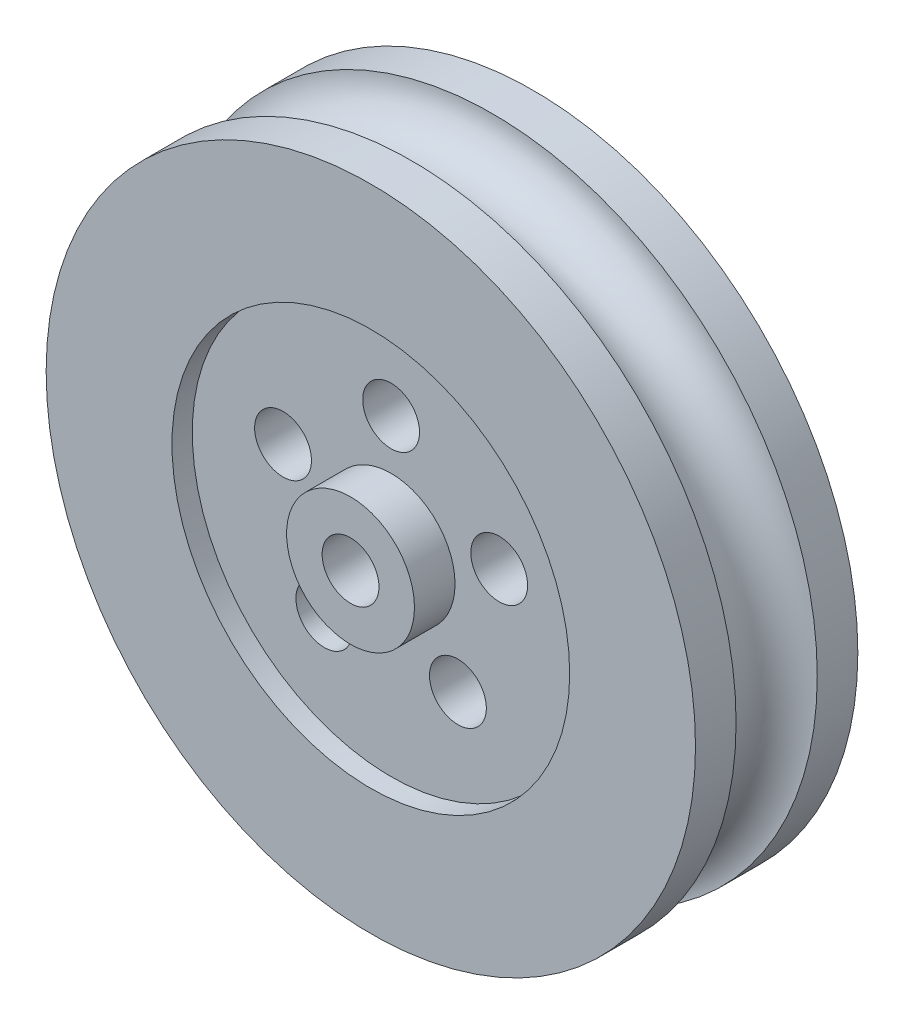
ISO-10303-21;
HEADER;
FILE_DESCRIPTION(('STEP AP214'),'2;1');
FILE_NAME('part.step','',(''),(''),'','','');
FILE_SCHEMA(('AUTOMOTIVE_DESIGN { 1 0 10303 214 1 1 1 1 }'));
ENDSEC;
DATA;
#1=APPLICATION_CONTEXT('core data for automotive mechanical design processes');
#2=APPLICATION_PROTOCOL_DEFINITION('international standard','automotive_design',2000,#1);
#3=PRODUCT_CONTEXT('',#1,'mechanical');
#4=PRODUCT('Part','Part','',(#3));
#5=PRODUCT_RELATED_PRODUCT_CATEGORY('part','',(#4));
#6=PRODUCT_DEFINITION_FORMATION('','',#4);
#7=PRODUCT_DEFINITION_CONTEXT('part definition',#1,'design');
#8=PRODUCT_DEFINITION('design','',#6,#7);
#9=PRODUCT_DEFINITION_SHAPE('','',#8);
#10=(LENGTH_UNIT() NAMED_UNIT(*) SI_UNIT(.MILLI.,.METRE.));
#11=(NAMED_UNIT(*) PLANE_ANGLE_UNIT() SI_UNIT($,.RADIAN.));
#12=(NAMED_UNIT(*) SI_UNIT($,.STERADIAN.) SOLID_ANGLE_UNIT());
#13=UNCERTAINTY_MEASURE_WITH_UNIT(LENGTH_MEASURE(1.E-05),#10,'distance_accuracy_value','');
#14=(GEOMETRIC_REPRESENTATION_CONTEXT(3) GLOBAL_UNCERTAINTY_ASSIGNED_CONTEXT((#13)) GLOBAL_UNIT_ASSIGNED_CONTEXT((#10,
#11,#12)) REPRESENTATION_CONTEXT('',''));
#15=CARTESIAN_POINT('',(0.,0.,0.));
#16=DIRECTION('',(0.,0.,1.));
#17=DIRECTION('',(1.,0.,0.));
#18=AXIS2_PLACEMENT_3D('',#15,#16,#17);
#19=CARTESIAN_POINT('',(0.,0.,4.));
#20=DIRECTION('',(0.,0.,-1.));
#21=DIRECTION('',(-1.,0.,0.));
#22=AXIS2_PLACEMENT_3D('',#19,#20,#21);
#23=CYLINDRICAL_SURFACE('',#22,16.);
#24=CARTESIAN_POINT('',(0.,0.,-4.));
#25=DIRECTION('',(0.,0.,1.));
#26=DIRECTION('',(1.,0.,0.));
#27=AXIS2_PLACEMENT_3D('',#24,#25,#26);
#28=CIRCLE('',#27,16.);
#29=CARTESIAN_POINT('',(16.,0.,-4.));
#30=VERTEX_POINT('',#29);
#31=EDGE_CURVE('E43',#30,#30,#28,.T.);
#32=ORIENTED_EDGE('',*,*,#31,.T.);
#33=EDGE_LOOP('',(#32));
#34=FACE_BOUND('',#33,.T.);
#35=CARTESIAN_POINT('',(0.,0.,-2.00000000000001));
#36=DIRECTION('',(0.,0.,1.));
#37=DIRECTION('',(1.,0.,0.));
#38=AXIS2_PLACEMENT_3D('',#35,#36,#37);
#39=CIRCLE('',#38,16.);
#40=CARTESIAN_POINT('',(16.,0.,-2.00000000000001));
#41=VERTEX_POINT('',#40);
#42=EDGE_CURVE('E34',#41,#41,#39,.T.);
#43=ORIENTED_EDGE('',*,*,#42,.F.);
#44=EDGE_LOOP('',(#43));
#45=FACE_BOUND('',#44,.T.);
#46=ADVANCED_FACE('F31',(#34,#45),#23,.T.);
#47=CARTESIAN_POINT('',(0.,0.,4.));
#48=DIRECTION('',(0.,0.,1.));
#49=DIRECTION('',(1.,0.,0.));
#50=AXIS2_PLACEMENT_3D('',#47,#48,#49);
#51=CIRCLE('',#50,16.);
#52=CARTESIAN_POINT('',(16.,0.,4.));
#53=VERTEX_POINT('',#52);
#54=EDGE_CURVE('E38',#53,#53,#51,.T.);
#55=ORIENTED_EDGE('',*,*,#54,.F.);
#56=EDGE_LOOP('',(#55));
#57=FACE_BOUND('',#56,.T.);
#58=CARTESIAN_POINT('',(0.,0.,2.00000000000001));
#59=DIRECTION('',(0.,0.,-1.));
#60=DIRECTION('',(-1.,0.,0.));
#61=AXIS2_PLACEMENT_3D('',#58,#59,#60);
#62=CIRCLE('',#61,16.);
#63=CARTESIAN_POINT('',(-16.,0.,2.00000000000001));
#64=VERTEX_POINT('',#63);
#65=EDGE_CURVE('E64',#64,#64,#62,.T.);
#66=ORIENTED_EDGE('',*,*,#65,.F.);
#67=EDGE_LOOP('',(#66));
#68=FACE_BOUND('',#67,.T.);
#69=ADVANCED_FACE('F123',(#57,#68),#23,.T.);
#70=CARTESIAN_POINT('',(0.,0.,4.));
#71=DIRECTION('',(0.,0.,-1.));
#72=DIRECTION('',(-1.,0.,0.));
#73=AXIS2_PLACEMENT_3D('',#70,#71,#72);
#74=CYLINDRICAL_SURFACE('',#73,1.4);
#75=CARTESIAN_POINT('',(0.,0.,5.));
#76=DIRECTION('',(0.,0.,1.));
#77=DIRECTION('',(1.,0.,0.));
#78=AXIS2_PLACEMENT_3D('',#75,#76,#77);
#79=CIRCLE('',#78,1.4);
#80=CARTESIAN_POINT('',(1.4,0.,5.));
#81=VERTEX_POINT('',#80);
#82=EDGE_CURVE('E95',#81,#81,#79,.T.);
#83=ORIENTED_EDGE('',*,*,#82,.T.);
#84=EDGE_LOOP('',(#83));
#85=FACE_BOUND('',#84,.T.);
#86=CARTESIAN_POINT('',(0.,0.,-5.));
#87=DIRECTION('',(0.,0.,1.));
#88=DIRECTION('',(1.,0.,0.));
#89=AXIS2_PLACEMENT_3D('',#86,#87,#88);
#90=CIRCLE('',#89,1.4);
#91=CARTESIAN_POINT('',(1.4,0.,-5.));
#92=VERTEX_POINT('',#91);
#93=EDGE_CURVE('E50',#92,#92,#90,.T.);
#94=ORIENTED_EDGE('',*,*,#93,.F.);
#95=EDGE_LOOP('',(#94));
#96=FACE_BOUND('',#95,.T.);
#97=ADVANCED_FACE('F126',(#85,#96),#74,.F.);
#98=CARTESIAN_POINT('',(0.,0.,3.));
#99=DIRECTION('',(0.,0.,1.));
#100=DIRECTION('',(1.,0.,0.));
#101=AXIS2_PLACEMENT_3D('',#98,#99,#100);
#102=PLANE('',#101);
#103=CARTESIAN_POINT('',(-5.32591649125284,1.73049516849977,3.));
#104=DIRECTION('',(0.,0.,1.));
#105=DIRECTION('',(0.309016994374958,0.95105651629515,0.));
#106=AXIS2_PLACEMENT_3D('',#103,#104,#105);
#107=CIRCLE('',#106,1.4);
#108=CARTESIAN_POINT('',(-4.8932926991279,3.06197429131298,3.));
#109=VERTEX_POINT('',#108);
#110=EDGE_CURVE('E69',#109,#109,#107,.T.);
#111=ORIENTED_EDGE('',*,*,#110,.F.);
#112=EDGE_LOOP('',(#111));
#113=FACE_BOUND('',#112,.T.);
#114=CARTESIAN_POINT('',(-3.29159741283789,-4.53049516849968,3.));
#115=DIRECTION('',(0.,0.,1.));
#116=DIRECTION('',(-0.809016994374942,0.58778525229248,0.));
#117=AXIS2_PLACEMENT_3D('',#114,#115,#116);
#118=CIRCLE('',#117,1.4);
#119=CARTESIAN_POINT('',(-4.42422120496281,-3.7075958152902,3.));
#120=VERTEX_POINT('',#119);
#121=EDGE_CURVE('E73',#120,#120,#118,.T.);
#122=ORIENTED_EDGE('',*,*,#121,.F.);
#123=EDGE_LOOP('',(#122));
#124=FACE_BOUND('',#123,.T.);
#125=CARTESIAN_POINT('',(3.29159741283782,-4.53049516849972,3.));
#126=DIRECTION('',(0.,0.,1.));
#127=DIRECTION('',(-0.809016994374951,-0.587785252292469,0.));
#128=AXIS2_PLACEMENT_3D('',#125,#126,#127);
#129=CIRCLE('',#128,1.4);
#130=CARTESIAN_POINT('',(2.15897362071289,-5.35339452170918,3.));
#131=VERTEX_POINT('',#130);
#132=EDGE_CURVE('E78',#131,#131,#129,.T.);
#133=ORIENTED_EDGE('',*,*,#132,.F.);
#134=EDGE_LOOP('',(#133));
#135=FACE_BOUND('',#134,.T.);
#136=CARTESIAN_POINT('',(5.32591649125287,1.73049516849969,3.));
#137=DIRECTION('',(0.,0.,1.));
#138=DIRECTION('',(0.309016994374945,-0.951056516295155,0.));
#139=AXIS2_PLACEMENT_3D('',#136,#137,#138);
#140=CIRCLE('',#139,1.4);
#141=CARTESIAN_POINT('',(5.75854028337779,0.399016045686474,3.));
#142=VERTEX_POINT('',#141);
#143=EDGE_CURVE('E56',#142,#142,#140,.T.);
#144=ORIENTED_EDGE('',*,*,#143,.F.);
#145=EDGE_LOOP('',(#144));
#146=FACE_BOUND('',#145,.T.);
#147=CARTESIAN_POINT('',(0.,5.6,3.));
#148=DIRECTION('',(0.,0.,1.));
#149=DIRECTION('',(1.,0.,0.));
#150=AXIS2_PLACEMENT_3D('',#147,#148,#149);
#151=CIRCLE('',#150,1.4);
#152=CARTESIAN_POINT('',(1.4,5.6,3.));
#153=VERTEX_POINT('',#152);
#154=EDGE_CURVE('E51',#153,#153,#151,.T.);
#155=ORIENTED_EDGE('',*,*,#154,.F.);
#156=EDGE_LOOP('',(#155));
#157=FACE_BOUND('',#156,.T.);
#158=CARTESIAN_POINT('',(0.,0.,3.));
#159=DIRECTION('',(0.,0.,1.));
#160=DIRECTION('',(1.,0.,0.));
#161=AXIS2_PLACEMENT_3D('',#158,#159,#160);
#162=CIRCLE('',#161,9.8);
#163=CARTESIAN_POINT('',(9.8,0.,3.));
#164=VERTEX_POINT('',#163);
#165=EDGE_CURVE('E107',#164,#164,#162,.T.);
#166=ORIENTED_EDGE('',*,*,#165,.T.);
#167=EDGE_LOOP('',(#166));
#168=FACE_BOUND('',#167,.T.);
#169=CARTESIAN_POINT('',(0.,0.,3.));
#170=DIRECTION('',(0.,0.,1.));
#171=DIRECTION('',(1.,0.,0.));
#172=AXIS2_PLACEMENT_3D('',#169,#170,#171);
#173=CIRCLE('',#172,3.15);
#174=CARTESIAN_POINT('',(3.15,0.,3.));
#175=VERTEX_POINT('',#174);
#176=EDGE_CURVE('E100',#175,#175,#173,.T.);
#177=ORIENTED_EDGE('',*,*,#176,.F.);
#178=EDGE_LOOP('',(#177));
#179=FACE_BOUND('',#178,.T.);
#180=ADVANCED_FACE('F119',(#113,#124,#135,#146,#157,#168,#179),#102,.T.);
#181=CARTESIAN_POINT('',(0.,0.,4.));
#182=DIRECTION('',(0.,0.,1.));
#183=DIRECTION('',(1.,0.,0.));
#184=AXIS2_PLACEMENT_3D('',#181,#182,#183);
#185=PLANE('',#184);
#186=CARTESIAN_POINT('',(0.,0.,4.));
#187=DIRECTION('',(0.,0.,1.));
#188=DIRECTION('',(1.,0.,0.));
#189=AXIS2_PLACEMENT_3D('',#186,#187,#188);
#190=CIRCLE('',#189,9.8);
#191=CARTESIAN_POINT('',(9.8,0.,4.));
#192=VERTEX_POINT('',#191);
#193=EDGE_CURVE('E104',#192,#192,#190,.T.);
#194=ORIENTED_EDGE('',*,*,#193,.F.);
#195=EDGE_LOOP('',(#194));
#196=FACE_BOUND('',#195,.T.);
#197=ORIENTED_EDGE('',*,*,#54,.T.);
#198=EDGE_LOOP('',(#197));
#199=FACE_BOUND('',#198,.T.);
#200=ADVANCED_FACE('F115',(#196,#199),#185,.T.);
#201=CARTESIAN_POINT('',(0.,0.,-4.));
#202=DIRECTION('',(0.,0.,1.));
#203=DIRECTION('',(1.,0.,0.));
#204=AXIS2_PLACEMENT_3D('',#201,#202,#203);
#205=PLANE('',#204);
#206=CARTESIAN_POINT('',(0.,0.,-4.));
#207=DIRECTION('',(0.,0.,1.));
#208=DIRECTION('',(1.,0.,0.));
#209=AXIS2_PLACEMENT_3D('',#206,#207,#208);
#210=CIRCLE('',#209,9.8);
#211=CARTESIAN_POINT('',(9.8,0.,-4.));
#212=VERTEX_POINT('',#211);
#213=EDGE_CURVE('E91',#212,#212,#210,.T.);
#214=ORIENTED_EDGE('',*,*,#213,.T.);
#215=EDGE_LOOP('',(#214));
#216=FACE_BOUND('',#215,.T.);
#217=ORIENTED_EDGE('',*,*,#31,.F.);
#218=EDGE_LOOP('',(#217));
#219=FACE_BOUND('',#218,.T.);
#220=ADVANCED_FACE('F118',(#216,#219),#205,.F.);
#221=CARTESIAN_POINT('',(0.,0.,3.));
#222=DIRECTION('',(0.,0.,1.));
#223=DIRECTION('',(1.,0.,0.));
#224=AXIS2_PLACEMENT_3D('',#221,#222,#223);
#225=CYLINDRICAL_SURFACE('',#224,9.8);
#226=ORIENTED_EDGE('',*,*,#165,.F.);
#227=EDGE_LOOP('',(#226));
#228=FACE_BOUND('',#227,.T.);
#229=ORIENTED_EDGE('',*,*,#193,.T.);
#230=EDGE_LOOP('',(#229));
#231=FACE_BOUND('',#230,.T.);
#232=ADVANCED_FACE('F113',(#228,#231),#225,.F.);
#233=CARTESIAN_POINT('',(0.,0.,5.));
#234=DIRECTION('',(0.,0.,1.));
#235=DIRECTION('',(1.,0.,0.));
#236=AXIS2_PLACEMENT_3D('',#233,#234,#235);
#237=PLANE('',#236);
#238=CARTESIAN_POINT('',(0.,0.,5.));
#239=DIRECTION('',(0.,0.,1.));
#240=DIRECTION('',(1.,0.,0.));
#241=AXIS2_PLACEMENT_3D('',#238,#239,#240);
#242=CIRCLE('',#241,3.15);
#243=CARTESIAN_POINT('',(3.15,0.,5.));
#244=VERTEX_POINT('',#243);
#245=EDGE_CURVE('E101',#244,#244,#242,.T.);
#246=ORIENTED_EDGE('',*,*,#245,.T.);
#247=EDGE_LOOP('',(#246));
#248=FACE_BOUND('',#247,.T.);
#249=ORIENTED_EDGE('',*,*,#82,.F.);
#250=EDGE_LOOP('',(#249));
#251=FACE_BOUND('',#250,.T.);
#252=ADVANCED_FACE('F145',(#248,#251),#237,.T.);
#253=CARTESIAN_POINT('',(0.,0.,5.));
#254=DIRECTION('',(0.,0.,-1.));
#255=DIRECTION('',(-1.,0.,0.));
#256=AXIS2_PLACEMENT_3D('',#253,#254,#255);
#257=CYLINDRICAL_SURFACE('',#256,3.15);
#258=ORIENTED_EDGE('',*,*,#245,.F.);
#259=EDGE_LOOP('',(#258));
#260=FACE_BOUND('',#259,.T.);
#261=ORIENTED_EDGE('',*,*,#176,.T.);
#262=EDGE_LOOP('',(#261));
#263=FACE_BOUND('',#262,.T.);
#264=ADVANCED_FACE('F152',(#260,#263),#257,.T.);
#265=CARTESIAN_POINT('',(0.,0.,-3.));
#266=DIRECTION('',(0.,0.,-1.));
#267=DIRECTION('',(-1.,0.,0.));
#268=AXIS2_PLACEMENT_3D('',#265,#266,#267);
#269=CYLINDRICAL_SURFACE('',#268,9.8);
#270=CARTESIAN_POINT('',(0.,0.,-3.));
#271=DIRECTION('',(0.,0.,1.));
#272=DIRECTION('',(1.,0.,0.));
#273=AXIS2_PLACEMENT_3D('',#270,#271,#272);
#274=CIRCLE('',#273,9.8);
#275=CARTESIAN_POINT('',(9.8,0.,-3.));
#276=VERTEX_POINT('',#275);
#277=EDGE_CURVE('E92',#276,#276,#274,.T.);
#278=ORIENTED_EDGE('',*,*,#277,.T.);
#279=EDGE_LOOP('',(#278));
#280=FACE_BOUND('',#279,.T.);
#281=ORIENTED_EDGE('',*,*,#213,.F.);
#282=EDGE_LOOP('',(#281));
#283=FACE_BOUND('',#282,.T.);
#284=ADVANCED_FACE('F155',(#280,#283),#269,.F.);
#285=CARTESIAN_POINT('',(0.,0.,-3.));
#286=DIRECTION('',(0.,0.,-1.));
#287=DIRECTION('',(1.,0.,0.));
#288=AXIS2_PLACEMENT_3D('',#285,#286,#287);
#289=PLANE('',#288);
#290=CARTESIAN_POINT('',(-5.32591649125284,1.73049516849977,-3.));
#291=DIRECTION('',(0.,0.,-1.));
#292=DIRECTION('',(-1.,0.,0.));
#293=AXIS2_PLACEMENT_3D('',#290,#291,#292);
#294=CIRCLE('',#293,1.4);
#295=CARTESIAN_POINT('',(-6.72591649125284,1.73049516849977,-3.));
#296=VERTEX_POINT('',#295);
#297=EDGE_CURVE('E62',#296,#296,#294,.T.);
#298=ORIENTED_EDGE('',*,*,#297,.F.);
#299=EDGE_LOOP('',(#298));
#300=FACE_BOUND('',#299,.T.);
#301=CARTESIAN_POINT('',(-3.29159741283789,-4.53049516849968,-3.));
#302=DIRECTION('',(0.,0.,-1.));
#303=DIRECTION('',(-1.,0.,0.));
#304=AXIS2_PLACEMENT_3D('',#301,#302,#303);
#305=CIRCLE('',#304,1.4);
#306=CARTESIAN_POINT('',(-4.69159741283789,-4.53049516849968,-3.));
#307=VERTEX_POINT('',#306);
#308=EDGE_CURVE('E59',#307,#307,#305,.T.);
#309=ORIENTED_EDGE('',*,*,#308,.F.);
#310=EDGE_LOOP('',(#309));
#311=FACE_BOUND('',#310,.T.);
#312=CARTESIAN_POINT('',(3.29159741283782,-4.53049516849972,-3.));
#313=DIRECTION('',(0.,0.,-1.));
#314=DIRECTION('',(-1.,0.,0.));
#315=AXIS2_PLACEMENT_3D('',#312,#313,#314);
#316=CIRCLE('',#315,1.4);
#317=CARTESIAN_POINT('',(1.89159741283782,-4.53049516849972,-3.));
#318=VERTEX_POINT('',#317);
#319=EDGE_CURVE('E55',#318,#318,#316,.T.);
#320=ORIENTED_EDGE('',*,*,#319,.F.);
#321=EDGE_LOOP('',(#320));
#322=FACE_BOUND('',#321,.T.);
#323=CARTESIAN_POINT('',(5.32591649125287,1.73049516849969,-3.));
#324=DIRECTION('',(0.,0.,-1.));
#325=DIRECTION('',(-1.,0.,0.));
#326=AXIS2_PLACEMENT_3D('',#323,#324,#325);
#327=CIRCLE('',#326,1.4);
#328=CARTESIAN_POINT('',(3.92591649125287,1.73049516849969,-3.));
#329=VERTEX_POINT('',#328);
#330=EDGE_CURVE('E52',#329,#329,#327,.T.);
#331=ORIENTED_EDGE('',*,*,#330,.F.);
#332=EDGE_LOOP('',(#331));
#333=FACE_BOUND('',#332,.T.);
#334=CARTESIAN_POINT('',(0.,5.6,-3.));
#335=DIRECTION('',(0.,0.,-1.));
#336=DIRECTION('',(-1.,0.,0.));
#337=AXIS2_PLACEMENT_3D('',#334,#335,#336);
#338=CIRCLE('',#337,1.4);
#339=CARTESIAN_POINT('',(-1.4,5.6,-3.));
#340=VERTEX_POINT('',#339);
#341=EDGE_CURVE('E47',#340,#340,#338,.T.);
#342=ORIENTED_EDGE('',*,*,#341,.F.);
#343=EDGE_LOOP('',(#342));
#344=FACE_BOUND('',#343,.T.);
#345=CARTESIAN_POINT('',(0.,0.,-3.));
#346=DIRECTION('',(0.,0.,-1.));
#347=DIRECTION('',(-1.,0.,0.));
#348=AXIS2_PLACEMENT_3D('',#345,#346,#347);
#349=CIRCLE('',#348,3.15);
#350=CARTESIAN_POINT('',(-3.15,0.,-3.));
#351=VERTEX_POINT('',#350);
#352=EDGE_CURVE('E10',#351,#351,#349,.T.);
#353=ORIENTED_EDGE('',*,*,#352,.F.);
#354=EDGE_LOOP('',(#353));
#355=FACE_BOUND('',#354,.T.);
#356=ORIENTED_EDGE('',*,*,#277,.F.);
#357=EDGE_LOOP('',(#356));
#358=FACE_BOUND('',#357,.T.);
#359=ADVANCED_FACE('F162',(#300,#311,#322,#333,#344,#355,#358),#289,.T.);
#360=CARTESIAN_POINT('',(0.,0.,-5.));
#361=DIRECTION('',(0.,0.,1.));
#362=DIRECTION('',(1.,0.,0.));
#363=AXIS2_PLACEMENT_3D('',#360,#361,#362);
#364=CYLINDRICAL_SURFACE('',#363,3.15);
#365=CARTESIAN_POINT('',(0.,0.,-5.));
#366=DIRECTION('',(0.,0.,1.));
#367=DIRECTION('',(1.,0.,0.));
#368=AXIS2_PLACEMENT_3D('',#365,#366,#367);
#369=CIRCLE('',#368,3.15);
#370=CARTESIAN_POINT('',(3.15,0.,-5.));
#371=VERTEX_POINT('',#370);
#372=EDGE_CURVE('E88',#371,#371,#369,.T.);
#373=ORIENTED_EDGE('',*,*,#372,.T.);
#374=EDGE_LOOP('',(#373));
#375=FACE_BOUND('',#374,.T.);
#376=ORIENTED_EDGE('',*,*,#352,.T.);
#377=EDGE_LOOP('',(#376));
#378=FACE_BOUND('',#377,.T.);
#379=ADVANCED_FACE('F166',(#375,#378),#364,.T.);
#380=CARTESIAN_POINT('',(0.,0.,-5.));
#381=DIRECTION('',(0.,0.,-1.));
#382=DIRECTION('',(1.,0.,0.));
#383=AXIS2_PLACEMENT_3D('',#380,#381,#382);
#384=PLANE('',#383);
#385=ORIENTED_EDGE('',*,*,#93,.T.);
#386=EDGE_LOOP('',(#385));
#387=FACE_BOUND('',#386,.T.);
#388=ORIENTED_EDGE('',*,*,#372,.F.);
#389=EDGE_LOOP('',(#388));
#390=FACE_BOUND('',#389,.T.);
#391=ADVANCED_FACE('F170',(#387,#390),#384,.T.);
#392=CARTESIAN_POINT('',(0.,5.6,-5.));
#393=DIRECTION('',(0.,0.,1.));
#394=DIRECTION('',(1.,0.,0.));
#395=AXIS2_PLACEMENT_3D('',#392,#393,#394);
#396=CYLINDRICAL_SURFACE('',#395,1.4);
#397=ORIENTED_EDGE('',*,*,#341,.T.);
#398=EDGE_LOOP('',(#397));
#399=FACE_BOUND('',#398,.T.);
#400=ORIENTED_EDGE('',*,*,#154,.T.);
#401=EDGE_LOOP('',(#400));
#402=FACE_BOUND('',#401,.T.);
#403=ADVANCED_FACE('F174',(#399,#402),#396,.F.);
#404=CARTESIAN_POINT('',(5.32591649125287,1.73049516849969,-5.));
#405=DIRECTION('',(0.,0.,1.));
#406=DIRECTION('',(1.,0.,0.));
#407=AXIS2_PLACEMENT_3D('',#404,#405,#406);
#408=CYLINDRICAL_SURFACE('',#407,1.4);
#409=ORIENTED_EDGE('',*,*,#330,.T.);
#410=EDGE_LOOP('',(#409));
#411=FACE_BOUND('',#410,.T.);
#412=ORIENTED_EDGE('',*,*,#143,.T.);
#413=EDGE_LOOP('',(#412));
#414=FACE_BOUND('',#413,.T.);
#415=ADVANCED_FACE('F178',(#411,#414),#408,.F.);
#416=CARTESIAN_POINT('',(3.29159741283782,-4.53049516849972,-5.));
#417=DIRECTION('',(0.,0.,1.));
#418=DIRECTION('',(1.,0.,0.));
#419=AXIS2_PLACEMENT_3D('',#416,#417,#418);
#420=CYLINDRICAL_SURFACE('',#419,1.4);
#421=ORIENTED_EDGE('',*,*,#319,.T.);
#422=EDGE_LOOP('',(#421));
#423=FACE_BOUND('',#422,.T.);
#424=ORIENTED_EDGE('',*,*,#132,.T.);
#425=EDGE_LOOP('',(#424));
#426=FACE_BOUND('',#425,.T.);
#427=ADVANCED_FACE('F182',(#423,#426),#420,.F.);
#428=CARTESIAN_POINT('',(-3.29159741283789,-4.53049516849968,-5.));
#429=DIRECTION('',(0.,0.,1.));
#430=DIRECTION('',(1.,0.,0.));
#431=AXIS2_PLACEMENT_3D('',#428,#429,#430);
#432=CYLINDRICAL_SURFACE('',#431,1.4);
#433=ORIENTED_EDGE('',*,*,#308,.T.);
#434=EDGE_LOOP('',(#433));
#435=FACE_BOUND('',#434,.T.);
#436=ORIENTED_EDGE('',*,*,#121,.T.);
#437=EDGE_LOOP('',(#436));
#438=FACE_BOUND('',#437,.T.);
#439=ADVANCED_FACE('F188',(#435,#438),#432,.F.);
#440=CARTESIAN_POINT('',(-5.32591649125284,1.73049516849977,-5.));
#441=DIRECTION('',(0.,0.,1.));
#442=DIRECTION('',(1.,0.,0.));
#443=AXIS2_PLACEMENT_3D('',#440,#441,#442);
#444=CYLINDRICAL_SURFACE('',#443,1.4);
#445=ORIENTED_EDGE('',*,*,#297,.T.);
#446=EDGE_LOOP('',(#445));
#447=FACE_BOUND('',#446,.T.);
#448=ORIENTED_EDGE('',*,*,#110,.T.);
#449=EDGE_LOOP('',(#448));
#450=FACE_BOUND('',#449,.T.);
#451=ADVANCED_FACE('F184',(#447,#450),#444,.F.);
#452=CARTESIAN_POINT('',(0.,0.,0.));
#453=DIRECTION('',(0.,0.,-1.));
#454=DIRECTION('',(-1.,0.,0.));
#455=AXIS2_PLACEMENT_3D('',#452,#453,#454);
#456=TOROIDAL_SURFACE('',#455,16.,2.00000000000001);
#457=ORIENTED_EDGE('',*,*,#65,.T.);
#458=EDGE_LOOP('',(#457));
#459=FACE_BOUND('',#458,.T.);
#460=ORIENTED_EDGE('',*,*,#42,.T.);
#461=EDGE_LOOP('',(#460));
#462=FACE_BOUND('',#461,.T.);
#463=ADVANCED_FACE('F187',(#459,#462),#456,.F.);
#464=CLOSED_SHELL('',(#46,#69,#97,#180,#200,#220,#232,#252,#264,#284,#359,#379,#391,#403,#415,
#427,#439,#451,#463));
#465=MANIFOLD_SOLID_BREP('B2',#464);
#466=ADVANCED_BREP_SHAPE_REPRESENTATION('',(#18,#465),#14);
#467=SHAPE_DEFINITION_REPRESENTATION(#9,#466);
ENDSEC;
END-ISO-10303-21;
